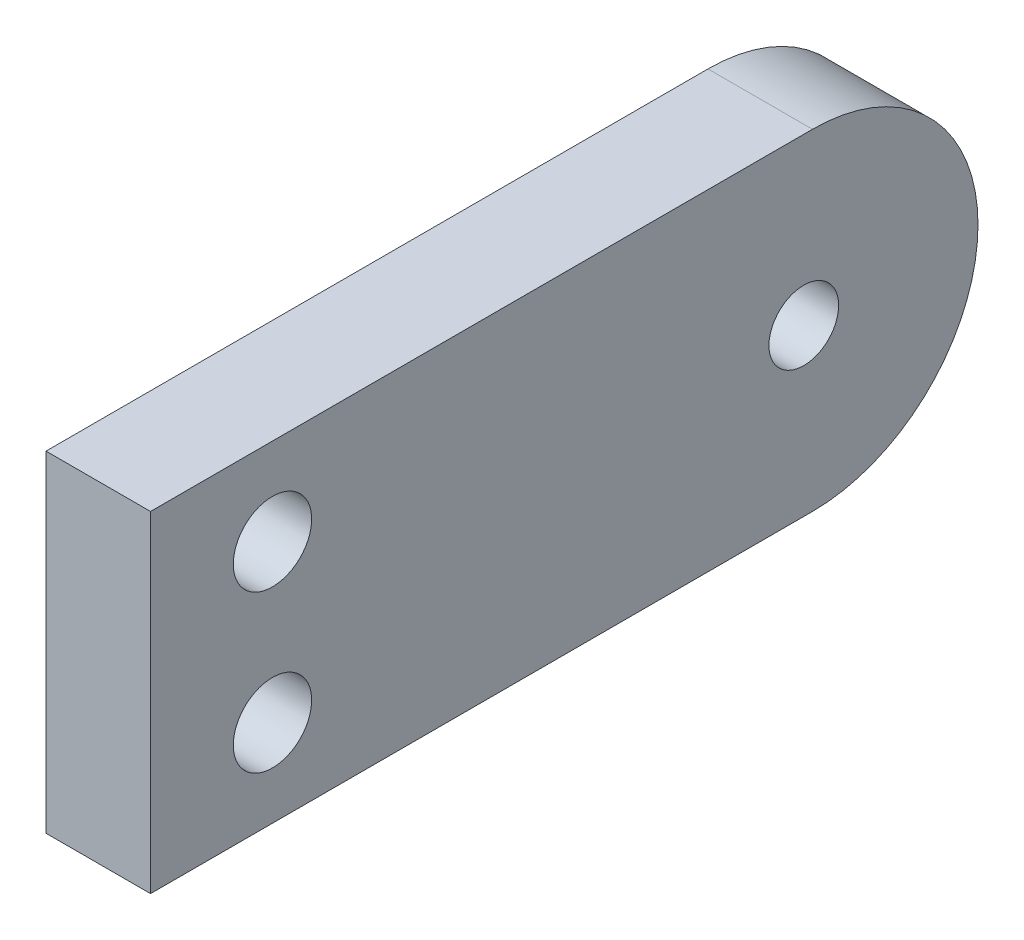
ISO-10303-21;
HEADER;
FILE_DESCRIPTION(('STEP AP214'),'2;1');
FILE_NAME('part.step','',(''),(''),'','','');
FILE_SCHEMA(('AUTOMOTIVE_DESIGN { 1 0 10303 214 1 1 1 1 }'));
ENDSEC;
DATA;
#1=APPLICATION_CONTEXT('core data for automotive mechanical design processes');
#2=APPLICATION_PROTOCOL_DEFINITION('international standard','automotive_design',2000,#1);
#3=PRODUCT_CONTEXT('',#1,'mechanical');
#4=PRODUCT('Part','Part','',(#3));
#5=PRODUCT_RELATED_PRODUCT_CATEGORY('part','',(#4));
#6=PRODUCT_DEFINITION_FORMATION('','',#4);
#7=PRODUCT_DEFINITION_CONTEXT('part definition',#1,'design');
#8=PRODUCT_DEFINITION('design','',#6,#7);
#9=PRODUCT_DEFINITION_SHAPE('','',#8);
#10=(LENGTH_UNIT() NAMED_UNIT(*) SI_UNIT(.MILLI.,.METRE.));
#11=(NAMED_UNIT(*) PLANE_ANGLE_UNIT() SI_UNIT($,.RADIAN.));
#12=(NAMED_UNIT(*) SI_UNIT($,.STERADIAN.) SOLID_ANGLE_UNIT());
#13=UNCERTAINTY_MEASURE_WITH_UNIT(LENGTH_MEASURE(1.E-05),#10,'distance_accuracy_value','');
#14=(GEOMETRIC_REPRESENTATION_CONTEXT(3) GLOBAL_UNCERTAINTY_ASSIGNED_CONTEXT((#13)) GLOBAL_UNIT_ASSIGNED_CONTEXT((#10,
#11,#12)) REPRESENTATION_CONTEXT('',''));
#15=CARTESIAN_POINT('',(0.,0.,0.));
#16=DIRECTION('',(0.,0.,1.));
#17=DIRECTION('',(1.,0.,0.));
#18=AXIS2_PLACEMENT_3D('',#15,#16,#17);
#19=CARTESIAN_POINT('',(22.,-4.5,-119.5));
#20=DIRECTION('',(1.,0.,0.));
#21=DIRECTION('',(0.,0.,1.));
#22=AXIS2_PLACEMENT_3D('',#19,#20,#21);
#23=CYLINDRICAL_SURFACE('',#22,1.5);
#24=CARTESIAN_POINT('',(22.,-4.5,-119.5));
#25=DIRECTION('',(-1.,0.,0.));
#26=DIRECTION('',(0.,0.,1.));
#27=AXIS2_PLACEMENT_3D('',#24,#25,#26);
#28=CIRCLE('',#27,1.5);
#29=CARTESIAN_POINT('',(22.,-4.5,-118.));
#30=VERTEX_POINT('',#29);
#31=EDGE_CURVE('E115',#30,#30,#28,.T.);
#32=ORIENTED_EDGE('',*,*,#31,.T.);
#33=EDGE_LOOP('',(#32));
#34=FACE_BOUND('',#33,.T.);
#35=CARTESIAN_POINT('',(24.,-4.5,-119.5));
#36=DIRECTION('',(-1.,0.,0.));
#37=DIRECTION('',(0.,1.,0.));
#38=AXIS2_PLACEMENT_3D('',#35,#36,#37);
#39=CIRCLE('',#38,1.5);
#40=CARTESIAN_POINT('',(24.,-3.,-119.5));
#41=VERTEX_POINT('',#40);
#42=EDGE_CURVE('E43',#41,#41,#39,.F.);
#43=ORIENTED_EDGE('',*,*,#42,.T.);
#44=EDGE_LOOP('',(#43));
#45=FACE_BOUND('',#44,.T.);
#46=ADVANCED_FACE('F39',(#34,#45),#23,.F.);
#47=CARTESIAN_POINT('',(22.,4.5,-119.5));
#48=DIRECTION('',(1.,0.,0.));
#49=DIRECTION('',(0.,0.,1.));
#50=AXIS2_PLACEMENT_3D('',#47,#48,#49);
#51=CYLINDRICAL_SURFACE('',#50,1.5);
#52=CARTESIAN_POINT('',(22.,4.5,-119.5));
#53=DIRECTION('',(-1.,0.,0.));
#54=DIRECTION('',(0.,0.,1.));
#55=AXIS2_PLACEMENT_3D('',#52,#53,#54);
#56=CIRCLE('',#55,1.5);
#57=CARTESIAN_POINT('',(22.,4.5,-118.));
#58=VERTEX_POINT('',#57);
#59=EDGE_CURVE('E94',#58,#58,#56,.T.);
#60=ORIENTED_EDGE('',*,*,#59,.T.);
#61=EDGE_LOOP('',(#60));
#62=FACE_BOUND('',#61,.T.);
#63=CARTESIAN_POINT('',(24.,4.5,-119.5));
#64=DIRECTION('',(-1.,0.,0.));
#65=DIRECTION('',(0.,1.,0.));
#66=AXIS2_PLACEMENT_3D('',#63,#64,#65);
#67=CIRCLE('',#66,1.5);
#68=CARTESIAN_POINT('',(24.,6.,-119.5));
#69=VERTEX_POINT('',#68);
#70=EDGE_CURVE('E109',#69,#69,#67,.F.);
#71=ORIENTED_EDGE('',*,*,#70,.T.);
#72=EDGE_LOOP('',(#71));
#73=FACE_BOUND('',#72,.T.);
#74=ADVANCED_FACE('F161',(#62,#73),#51,.F.);
#75=CARTESIAN_POINT('',(28.,0.,0.));
#76=DIRECTION('',(1.,0.,0.));
#77=DIRECTION('',(0.,0.,1.));
#78=AXIS2_PLACEMENT_3D('',#75,#76,#77);
#79=PLANE('',#78);
#80=CARTESIAN_POINT('',(28.,4.5,-119.5));
#81=DIRECTION('',(-1.,0.,0.));
#82=DIRECTION('',(0.,0.,1.));
#83=AXIS2_PLACEMENT_3D('',#80,#81,#82);
#84=CIRCLE('',#83,2.25);
#85=CARTESIAN_POINT('',(28.,4.5,-117.25));
#86=VERTEX_POINT('',#85);
#87=EDGE_CURVE('E117',#86,#86,#84,.T.);
#88=ORIENTED_EDGE('',*,*,#87,.T.);
#89=EDGE_LOOP('',(#88));
#90=FACE_BOUND('',#89,.T.);
#91=CARTESIAN_POINT('',(28.,-4.5,-119.5));
#92=DIRECTION('',(-1.,0.,0.));
#93=DIRECTION('',(0.,0.,1.));
#94=AXIS2_PLACEMENT_3D('',#91,#92,#93);
#95=CIRCLE('',#94,2.25);
#96=CARTESIAN_POINT('',(28.,-4.5,-117.25));
#97=VERTEX_POINT('',#96);
#98=EDGE_CURVE('E122',#97,#97,#95,.T.);
#99=ORIENTED_EDGE('',*,*,#98,.T.);
#100=EDGE_LOOP('',(#99));
#101=FACE_BOUND('',#100,.T.);
#102=DIRECTION('',(0.,-1.,0.));
#103=VECTOR('',#102,1.);
#104=CARTESIAN_POINT('',(28.,9.5,-112.5));
#105=LINE('',#104,#103);
#106=CARTESIAN_POINT('',(28.,9.5,-112.5));
#107=VERTEX_POINT('',#106);
#108=CARTESIAN_POINT('',(28.,-9.5,-112.5));
#109=VERTEX_POINT('',#108);
#110=EDGE_CURVE('E90',#107,#109,#105,.T.);
#111=ORIENTED_EDGE('',*,*,#110,.T.);
#112=DIRECTION('',(0.,0.,1.));
#113=VECTOR('',#112,1.);
#114=CARTESIAN_POINT('',(28.,-9.5,-160.));
#115=LINE('',#114,#113);
#116=CARTESIAN_POINT('',(28.,-9.5,-150.5));
#117=VERTEX_POINT('',#116);
#118=EDGE_CURVE('E85',#117,#109,#115,.T.);
#119=ORIENTED_EDGE('',*,*,#118,.F.);
#120=CARTESIAN_POINT('',(28.,0.,-150.5));
#121=DIRECTION('',(-1.,0.,0.));
#122=DIRECTION('',(0.,0.,1.));
#123=AXIS2_PLACEMENT_3D('',#120,#121,#122);
#124=CIRCLE('',#123,9.5);
#125=CARTESIAN_POINT('',(28.,9.5,-150.5));
#126=VERTEX_POINT('',#125);
#127=EDGE_CURVE('E48',#126,#117,#124,.T.);
#128=ORIENTED_EDGE('',*,*,#127,.F.);
#129=DIRECTION('',(0.,0.,1.));
#130=VECTOR('',#129,1.);
#131=CARTESIAN_POINT('',(28.,9.5,-160.));
#132=LINE('',#131,#130);
#133=EDGE_CURVE('E100',#126,#107,#132,.T.);
#134=ORIENTED_EDGE('',*,*,#133,.T.);
#135=EDGE_LOOP('',(#111,#119,#128,#134));
#136=FACE_BOUND('',#135,.T.);
#137=CARTESIAN_POINT('',(28.,0.,-150.));
#138=DIRECTION('',(-1.,0.,0.));
#139=DIRECTION('',(0.,0.,1.));
#140=AXIS2_PLACEMENT_3D('',#137,#138,#139);
#141=CIRCLE('',#140,2.);
#142=CARTESIAN_POINT('',(28.,0.,-148.));
#143=VERTEX_POINT('',#142);
#144=EDGE_CURVE('E135',#143,#143,#141,.T.);
#145=ORIENTED_EDGE('',*,*,#144,.T.);
#146=EDGE_LOOP('',(#145));
#147=FACE_BOUND('',#146,.T.);
#148=ADVANCED_FACE('F144',(#90,#101,#136,#147),#79,.T.);
#149=CARTESIAN_POINT('',(28.,9.5,-160.));
#150=DIRECTION('',(0.,-1.,0.));
#151=DIRECTION('',(0.,0.,1.));
#152=AXIS2_PLACEMENT_3D('',#149,#150,#151);
#153=PLANE('',#152);
#154=DIRECTION('',(1.,0.,0.));
#155=VECTOR('',#154,1.);
#156=CARTESIAN_POINT('',(0.,9.5,-112.5));
#157=LINE('',#156,#155);
#158=CARTESIAN_POINT('',(22.,9.5,-112.5));
#159=VERTEX_POINT('',#158);
#160=EDGE_CURVE('E89',#159,#107,#157,.T.);
#161=ORIENTED_EDGE('',*,*,#160,.T.);
#162=ORIENTED_EDGE('',*,*,#133,.F.);
#163=DIRECTION('',(-1.,0.,0.));
#164=VECTOR('',#163,1.);
#165=CARTESIAN_POINT('',(28.,9.5,-150.5));
#166=LINE('',#165,#164);
#167=CARTESIAN_POINT('',(22.,9.5,-150.5));
#168=VERTEX_POINT('',#167);
#169=EDGE_CURVE('E107',#168,#126,#166,.F.);
#170=ORIENTED_EDGE('',*,*,#169,.F.);
#171=DIRECTION('',(0.,0.,1.));
#172=VECTOR('',#171,1.);
#173=CARTESIAN_POINT('',(22.,9.5,-160.));
#174=LINE('',#173,#172);
#175=EDGE_CURVE('E98',#168,#159,#174,.T.);
#176=ORIENTED_EDGE('',*,*,#175,.T.);
#177=EDGE_LOOP('',(#161,#162,#170,#176));
#178=FACE_BOUND('',#177,.T.);
#179=ADVANCED_FACE('F148',(#178),#153,.F.);
#180=CARTESIAN_POINT('',(22.,9.5,-160.));
#181=DIRECTION('',(1.,0.,0.));
#182=DIRECTION('',(0.,1.,0.));
#183=AXIS2_PLACEMENT_3D('',#180,#181,#182);
#184=PLANE('',#183);
#185=ORIENTED_EDGE('',*,*,#59,.F.);
#186=EDGE_LOOP('',(#185));
#187=FACE_BOUND('',#186,.T.);
#188=ORIENTED_EDGE('',*,*,#31,.F.);
#189=EDGE_LOOP('',(#188));
#190=FACE_BOUND('',#189,.T.);
#191=CARTESIAN_POINT('',(22.,0.,-150.));
#192=DIRECTION('',(-1.,0.,0.));
#193=DIRECTION('',(0.,1.,0.));
#194=AXIS2_PLACEMENT_3D('',#191,#192,#193);
#195=CIRCLE('',#194,2.);
#196=CARTESIAN_POINT('',(22.,2.,-150.));
#197=VERTEX_POINT('',#196);
#198=EDGE_CURVE('E102',#197,#197,#195,.F.);
#199=ORIENTED_EDGE('',*,*,#198,.T.);
#200=EDGE_LOOP('',(#199));
#201=FACE_BOUND('',#200,.T.);
#202=CARTESIAN_POINT('',(22.,0.,-150.5));
#203=DIRECTION('',(-1.,0.,0.));
#204=DIRECTION('',(0.,1.,0.));
#205=AXIS2_PLACEMENT_3D('',#202,#203,#204);
#206=CIRCLE('',#205,9.5);
#207=CARTESIAN_POINT('',(22.,-9.5,-150.5));
#208=VERTEX_POINT('',#207);
#209=EDGE_CURVE('E97',#208,#168,#206,.F.);
#210=ORIENTED_EDGE('',*,*,#209,.F.);
#211=DIRECTION('',(0.,0.,1.));
#212=VECTOR('',#211,1.);
#213=CARTESIAN_POINT('',(22.,-9.5,-160.));
#214=LINE('',#213,#212);
#215=CARTESIAN_POINT('',(22.,-9.5,-112.5));
#216=VERTEX_POINT('',#215);
#217=EDGE_CURVE('E82',#208,#216,#214,.T.);
#218=ORIENTED_EDGE('',*,*,#217,.T.);
#219=DIRECTION('',(0.,-1.,0.));
#220=VECTOR('',#219,1.);
#221=CARTESIAN_POINT('',(22.,9.5,-112.5));
#222=LINE('',#221,#220);
#223=EDGE_CURVE('E56',#159,#216,#222,.T.);
#224=ORIENTED_EDGE('',*,*,#223,.F.);
#225=ORIENTED_EDGE('',*,*,#175,.F.);
#226=EDGE_LOOP('',(#210,#218,#224,#225));
#227=FACE_BOUND('',#226,.T.);
#228=ADVANCED_FACE('F96',(#187,#190,#201,#227),#184,.F.);
#229=CARTESIAN_POINT('',(28.,-9.5,-160.));
#230=DIRECTION('',(0.,-1.,0.));
#231=DIRECTION('',(0.,0.,1.));
#232=AXIS2_PLACEMENT_3D('',#229,#230,#231);
#233=PLANE('',#232);
#234=ORIENTED_EDGE('',*,*,#217,.F.);
#235=DIRECTION('',(-1.,0.,0.));
#236=VECTOR('',#235,1.);
#237=CARTESIAN_POINT('',(22.,-9.5,-150.5));
#238=LINE('',#237,#236);
#239=EDGE_CURVE('E12',#117,#208,#238,.T.);
#240=ORIENTED_EDGE('',*,*,#239,.F.);
#241=ORIENTED_EDGE('',*,*,#118,.T.);
#242=DIRECTION('',(1.,0.,0.));
#243=VECTOR('',#242,1.);
#244=CARTESIAN_POINT('',(0.,-9.5,-112.5));
#245=LINE('',#244,#243);
#246=EDGE_CURVE('E80',#216,#109,#245,.T.);
#247=ORIENTED_EDGE('',*,*,#246,.F.);
#248=EDGE_LOOP('',(#234,#240,#241,#247));
#249=FACE_BOUND('',#248,.T.);
#250=ADVANCED_FACE('F81',(#249),#233,.T.);
#251=CARTESIAN_POINT('',(28.,0.,-150.));
#252=DIRECTION('',(-1.,0.,0.));
#253=DIRECTION('',(0.,0.,-1.));
#254=AXIS2_PLACEMENT_3D('',#251,#252,#253);
#255=CYLINDRICAL_SURFACE('',#254,2.);
#256=ORIENTED_EDGE('',*,*,#144,.F.);
#257=EDGE_LOOP('',(#256));
#258=FACE_BOUND('',#257,.T.);
#259=ORIENTED_EDGE('',*,*,#198,.F.);
#260=EDGE_LOOP('',(#259));
#261=FACE_BOUND('',#260,.T.);
#262=ADVANCED_FACE('F151',(#258,#261),#255,.F.);
#263=CARTESIAN_POINT('',(28.,0.,-150.5));
#264=DIRECTION('',(1.,0.,0.));
#265=DIRECTION('',(0.,0.,1.));
#266=AXIS2_PLACEMENT_3D('',#263,#264,#265);
#267=CYLINDRICAL_SURFACE('',#266,9.5);
#268=ORIENTED_EDGE('',*,*,#239,.T.);
#269=ORIENTED_EDGE('',*,*,#209,.T.);
#270=ORIENTED_EDGE('',*,*,#169,.T.);
#271=ORIENTED_EDGE('',*,*,#127,.T.);
#272=EDGE_LOOP('',(#268,#269,#270,#271));
#273=FACE_BOUND('',#272,.T.);
#274=ADVANCED_FACE('F41',(#273),#267,.T.);
#275=CARTESIAN_POINT('',(0.,9.5,-112.5));
#276=DIRECTION('',(0.,0.,-1.));
#277=DIRECTION('',(1.,0.,0.));
#278=AXIS2_PLACEMENT_3D('',#275,#276,#277);
#279=PLANE('',#278);
#280=ORIENTED_EDGE('',*,*,#246,.T.);
#281=ORIENTED_EDGE('',*,*,#110,.F.);
#282=ORIENTED_EDGE('',*,*,#160,.F.);
#283=ORIENTED_EDGE('',*,*,#223,.T.);
#284=EDGE_LOOP('',(#280,#281,#282,#283));
#285=FACE_BOUND('',#284,.T.);
#286=ADVANCED_FACE('F93',(#285),#279,.F.);
#287=CARTESIAN_POINT('',(24.,9.5,-160.));
#288=DIRECTION('',(1.,0.,0.));
#289=DIRECTION('',(0.,1.,0.));
#290=AXIS2_PLACEMENT_3D('',#287,#288,#289);
#291=PLANE('',#290);
#292=CARTESIAN_POINT('',(24.,4.5,-119.5));
#293=DIRECTION('',(-1.,0.,0.));
#294=DIRECTION('',(0.,1.,0.));
#295=AXIS2_PLACEMENT_3D('',#292,#293,#294);
#296=CIRCLE('',#295,2.25);
#297=CARTESIAN_POINT('',(24.,6.75,-119.5));
#298=VERTEX_POINT('',#297);
#299=EDGE_CURVE('E111',#298,#298,#296,.F.);
#300=ORIENTED_EDGE('',*,*,#299,.T.);
#301=EDGE_LOOP('',(#300));
#302=FACE_BOUND('',#301,.T.);
#303=ORIENTED_EDGE('',*,*,#70,.F.);
#304=EDGE_LOOP('',(#303));
#305=FACE_BOUND('',#304,.T.);
#306=ADVANCED_FACE('F156',(#302,#305),#291,.T.);
#307=CARTESIAN_POINT('',(15.6360389693211,4.5,-119.5));
#308=DIRECTION('',(1.,0.,0.));
#309=DIRECTION('',(0.,0.,1.));
#310=AXIS2_PLACEMENT_3D('',#307,#308,#309);
#311=CYLINDRICAL_SURFACE('',#310,2.25);
#312=ORIENTED_EDGE('',*,*,#299,.F.);
#313=EDGE_LOOP('',(#312));
#314=FACE_BOUND('',#313,.T.);
#315=ORIENTED_EDGE('',*,*,#87,.F.);
#316=EDGE_LOOP('',(#315));
#317=FACE_BOUND('',#316,.T.);
#318=ADVANCED_FACE('F194',(#314,#317),#311,.F.);
#319=CARTESIAN_POINT('',(24.,9.5,-160.));
#320=DIRECTION('',(1.,0.,0.));
#321=DIRECTION('',(0.,1.,0.));
#322=AXIS2_PLACEMENT_3D('',#319,#320,#321);
#323=PLANE('',#322);
#324=CARTESIAN_POINT('',(24.,-4.5,-119.5));
#325=DIRECTION('',(-1.,0.,0.));
#326=DIRECTION('',(0.,1.,0.));
#327=AXIS2_PLACEMENT_3D('',#324,#325,#326);
#328=CIRCLE('',#327,2.25);
#329=CARTESIAN_POINT('',(24.,-2.25000000000001,-119.5));
#330=VERTEX_POINT('',#329);
#331=EDGE_CURVE('E125',#330,#330,#328,.F.);
#332=ORIENTED_EDGE('',*,*,#331,.T.);
#333=EDGE_LOOP('',(#332));
#334=FACE_BOUND('',#333,.T.);
#335=ORIENTED_EDGE('',*,*,#42,.F.);
#336=EDGE_LOOP('',(#335));
#337=FACE_BOUND('',#336,.T.);
#338=ADVANCED_FACE('F188',(#334,#337),#323,.T.);
#339=CARTESIAN_POINT('',(15.6360389693211,-4.5,-119.5));
#340=DIRECTION('',(1.,0.,0.));
#341=DIRECTION('',(0.,0.,1.));
#342=AXIS2_PLACEMENT_3D('',#339,#340,#341);
#343=CYLINDRICAL_SURFACE('',#342,2.25);
#344=ORIENTED_EDGE('',*,*,#331,.F.);
#345=EDGE_LOOP('',(#344));
#346=FACE_BOUND('',#345,.T.);
#347=ORIENTED_EDGE('',*,*,#98,.F.);
#348=EDGE_LOOP('',(#347));
#349=FACE_BOUND('',#348,.T.);
#350=ADVANCED_FACE('F186',(#346,#349),#343,.F.);
#351=CLOSED_SHELL('',(#46,#74,#148,#179,#228,#250,#262,#274,#286,#306,#318,#338,#350));
#352=MANIFOLD_SOLID_BREP('B2',#351);
#353=ADVANCED_BREP_SHAPE_REPRESENTATION('',(#18,#352),#14);
#354=SHAPE_DEFINITION_REPRESENTATION(#9,#353);
ENDSEC;
END-ISO-10303-21;
